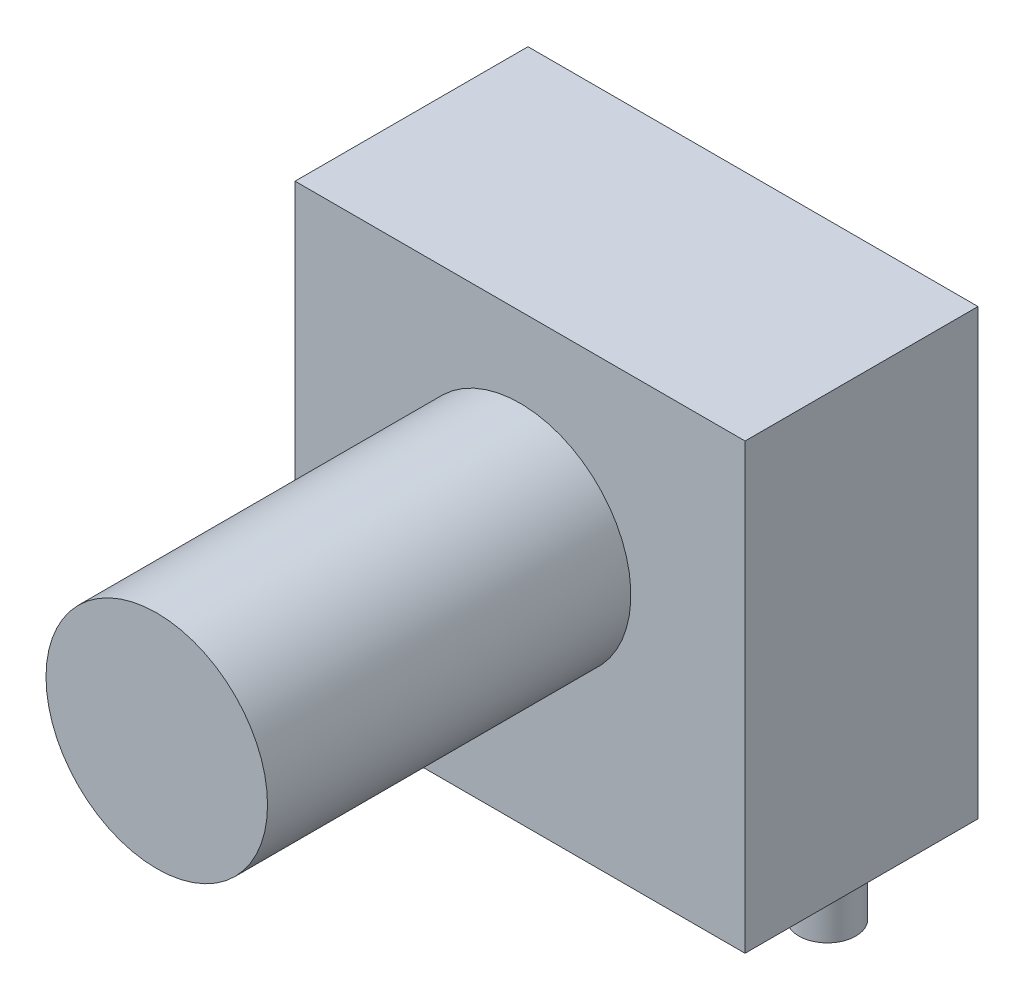
ISO-10303-21;
HEADER;
FILE_DESCRIPTION(('STEP AP214'),'2;1');
FILE_NAME('part.step','',(''),(''),'','','');
FILE_SCHEMA(('AUTOMOTIVE_DESIGN { 1 0 10303 214 1 1 1 1 }'));
ENDSEC;
DATA;
#1=APPLICATION_CONTEXT('core data for automotive mechanical design processes');
#2=APPLICATION_PROTOCOL_DEFINITION('international standard','automotive_design',2000,#1);
#3=PRODUCT_CONTEXT('',#1,'mechanical');
#4=PRODUCT('Part','Part','',(#3));
#5=PRODUCT_RELATED_PRODUCT_CATEGORY('part','',(#4));
#6=PRODUCT_DEFINITION_FORMATION('','',#4);
#7=PRODUCT_DEFINITION_CONTEXT('part definition',#1,'design');
#8=PRODUCT_DEFINITION('design','',#6,#7);
#9=PRODUCT_DEFINITION_SHAPE('','',#8);
#10=(LENGTH_UNIT() NAMED_UNIT(*) SI_UNIT(.MILLI.,.METRE.));
#11=(NAMED_UNIT(*) PLANE_ANGLE_UNIT() SI_UNIT($,.RADIAN.));
#12=(NAMED_UNIT(*) SI_UNIT($,.STERADIAN.) SOLID_ANGLE_UNIT());
#13=UNCERTAINTY_MEASURE_WITH_UNIT(LENGTH_MEASURE(1.E-05),#10,'distance_accuracy_value','');
#14=(GEOMETRIC_REPRESENTATION_CONTEXT(3) GLOBAL_UNCERTAINTY_ASSIGNED_CONTEXT((#13)) GLOBAL_UNIT_ASSIGNED_CONTEXT((#10,
#11,#12)) REPRESENTATION_CONTEXT('',''));
#15=CARTESIAN_POINT('',(0.,0.,0.));
#16=DIRECTION('',(0.,0.,1.));
#17=DIRECTION('',(1.,0.,0.));
#18=AXIS2_PLACEMENT_3D('',#15,#16,#17);
#19=CARTESIAN_POINT('',(-3.555,7.01,1.84));
#20=DIRECTION('',(0.,0.,-1.));
#21=DIRECTION('',(-1.,0.,0.));
#22=AXIS2_PLACEMENT_3D('',#19,#20,#21);
#23=PLANE('',#22);
#24=DIRECTION('',(1.,0.,0.));
#25=VECTOR('',#24,1.);
#26=CARTESIAN_POINT('',(-3.555,0.,1.84));
#27=LINE('',#26,#25);
#28=CARTESIAN_POINT('',(-3.555,0.,1.84));
#29=VERTEX_POINT('',#28);
#30=CARTESIAN_POINT('',(3.555,0.,1.84));
#31=VERTEX_POINT('',#30);
#32=EDGE_CURVE('E73',#29,#31,#27,.T.);
#33=ORIENTED_EDGE('',*,*,#32,.T.);
#34=DIRECTION('',(0.,-1.,0.));
#35=VECTOR('',#34,1.);
#36=CARTESIAN_POINT('',(3.555,7.01,1.84));
#37=LINE('',#36,#35);
#38=CARTESIAN_POINT('',(3.555,7.01,1.84));
#39=VERTEX_POINT('',#38);
#40=EDGE_CURVE('E97',#39,#31,#37,.T.);
#41=ORIENTED_EDGE('',*,*,#40,.F.);
#42=DIRECTION('',(1.,0.,0.));
#43=VECTOR('',#42,1.);
#44=CARTESIAN_POINT('',(-3.555,7.01,1.84));
#45=LINE('',#44,#43);
#46=CARTESIAN_POINT('',(-3.555,7.01,1.84));
#47=VERTEX_POINT('',#46);
#48=EDGE_CURVE('E50',#47,#39,#45,.T.);
#49=ORIENTED_EDGE('',*,*,#48,.F.);
#50=DIRECTION('',(0.,-1.,0.));
#51=VECTOR('',#50,1.);
#52=CARTESIAN_POINT('',(-3.555,7.01,1.84));
#53=LINE('',#52,#51);
#54=EDGE_CURVE('E93',#47,#29,#53,.T.);
#55=ORIENTED_EDGE('',*,*,#54,.T.);
#56=EDGE_LOOP('',(#33,#41,#49,#55));
#57=FACE_BOUND('',#56,.T.);
#58=CARTESIAN_POINT('',(0.,4.,1.84));
#59=DIRECTION('',(0.,0.,-1.));
#60=DIRECTION('',(-1.,0.,0.));
#61=AXIS2_PLACEMENT_3D('',#58,#59,#60);
#62=CIRCLE('',#61,1.75);
#63=CARTESIAN_POINT('',(-1.75,4.,1.84));
#64=VERTEX_POINT('',#63);
#65=EDGE_CURVE('E111',#64,#64,#62,.F.);
#66=ORIENTED_EDGE('',*,*,#65,.F.);
#67=EDGE_LOOP('',(#66));
#68=FACE_BOUND('',#67,.T.);
#69=ADVANCED_FACE('F33',(#57,#68),#23,.F.);
#70=CARTESIAN_POINT('',(3.555,7.01,1.84));
#71=DIRECTION('',(-1.,0.,0.));
#72=DIRECTION('',(0.,0.,1.));
#73=AXIS2_PLACEMENT_3D('',#70,#71,#72);
#74=PLANE('',#73);
#75=DIRECTION('',(0.,0.,-1.));
#76=VECTOR('',#75,1.);
#77=CARTESIAN_POINT('',(3.555,0.,1.84));
#78=LINE('',#77,#76);
#79=CARTESIAN_POINT('',(3.555,0.,-1.84));
#80=VERTEX_POINT('',#79);
#81=EDGE_CURVE('E101',#31,#80,#78,.T.);
#82=ORIENTED_EDGE('',*,*,#81,.T.);
#83=DIRECTION('',(0.,-1.,0.));
#84=VECTOR('',#83,1.);
#85=CARTESIAN_POINT('',(3.555,7.01,-1.84));
#86=LINE('',#85,#84);
#87=CARTESIAN_POINT('',(3.555,7.01,-1.84));
#88=VERTEX_POINT('',#87);
#89=EDGE_CURVE('E92',#88,#80,#86,.T.);
#90=ORIENTED_EDGE('',*,*,#89,.F.);
#91=DIRECTION('',(0.,0.,-1.));
#92=VECTOR('',#91,1.);
#93=CARTESIAN_POINT('',(3.555,7.01,1.84));
#94=LINE('',#93,#92);
#95=EDGE_CURVE('E86',#39,#88,#94,.T.);
#96=ORIENTED_EDGE('',*,*,#95,.F.);
#97=ORIENTED_EDGE('',*,*,#40,.T.);
#98=EDGE_LOOP('',(#82,#90,#96,#97));
#99=FACE_BOUND('',#98,.T.);
#100=ADVANCED_FACE('F35',(#99),#74,.F.);
#101=CARTESIAN_POINT('',(-3.555,7.01,-1.84));
#102=DIRECTION('',(0.,0.,1.));
#103=DIRECTION('',(1.,0.,0.));
#104=AXIS2_PLACEMENT_3D('',#101,#102,#103);
#105=PLANE('',#104);
#106=DIRECTION('',(-1.,0.,0.));
#107=VECTOR('',#106,1.);
#108=CARTESIAN_POINT('',(-3.555,0.,-1.84));
#109=LINE('',#108,#107);
#110=CARTESIAN_POINT('',(-3.555,0.,-1.84));
#111=VERTEX_POINT('',#110);
#112=EDGE_CURVE('E91',#80,#111,#109,.T.);
#113=ORIENTED_EDGE('',*,*,#112,.T.);
#114=DIRECTION('',(0.,-1.,0.));
#115=VECTOR('',#114,1.);
#116=CARTESIAN_POINT('',(-3.555,7.01,-1.84));
#117=LINE('',#116,#115);
#118=CARTESIAN_POINT('',(-3.555,7.01,-1.84));
#119=VERTEX_POINT('',#118);
#120=EDGE_CURVE('E89',#119,#111,#117,.T.);
#121=ORIENTED_EDGE('',*,*,#120,.F.);
#122=DIRECTION('',(-1.,0.,0.));
#123=VECTOR('',#122,1.);
#124=CARTESIAN_POINT('',(-3.555,7.01,-1.84));
#125=LINE('',#124,#123);
#126=EDGE_CURVE('E81',#88,#119,#125,.T.);
#127=ORIENTED_EDGE('',*,*,#126,.F.);
#128=ORIENTED_EDGE('',*,*,#89,.T.);
#129=EDGE_LOOP('',(#113,#121,#127,#128));
#130=FACE_BOUND('',#129,.T.);
#131=ADVANCED_FACE('F90',(#130),#105,.F.);
#132=CARTESIAN_POINT('',(-3.555,7.01,1.84));
#133=DIRECTION('',(1.,0.,0.));
#134=DIRECTION('',(0.,0.,-1.));
#135=AXIS2_PLACEMENT_3D('',#132,#133,#134);
#136=PLANE('',#135);
#137=DIRECTION('',(0.,0.,1.));
#138=VECTOR('',#137,1.);
#139=CARTESIAN_POINT('',(-3.555,0.,1.84));
#140=LINE('',#139,#138);
#141=EDGE_CURVE('E67',#111,#29,#140,.T.);
#142=ORIENTED_EDGE('',*,*,#141,.T.);
#143=ORIENTED_EDGE('',*,*,#54,.F.);
#144=DIRECTION('',(0.,0.,1.));
#145=VECTOR('',#144,1.);
#146=CARTESIAN_POINT('',(-3.555,7.01,1.84));
#147=LINE('',#146,#145);
#148=EDGE_CURVE('E84',#119,#47,#147,.T.);
#149=ORIENTED_EDGE('',*,*,#148,.F.);
#150=ORIENTED_EDGE('',*,*,#120,.T.);
#151=EDGE_LOOP('',(#142,#143,#149,#150));
#152=FACE_BOUND('',#151,.T.);
#153=ADVANCED_FACE('F95',(#152),#136,.F.);
#154=CARTESIAN_POINT('',(0.,7.01,0.));
#155=DIRECTION('',(0.,-1.,0.));
#156=DIRECTION('',(0.,0.,-1.));
#157=AXIS2_PLACEMENT_3D('',#154,#155,#156);
#158=PLANE('',#157);
#159=ORIENTED_EDGE('',*,*,#95,.T.);
#160=ORIENTED_EDGE('',*,*,#126,.T.);
#161=ORIENTED_EDGE('',*,*,#148,.T.);
#162=ORIENTED_EDGE('',*,*,#48,.T.);
#163=EDGE_LOOP('',(#159,#160,#161,#162));
#164=FACE_BOUND('',#163,.T.);
#165=ADVANCED_FACE('F82',(#164),#158,.F.);
#166=CARTESIAN_POINT('',(0.,0.,0.));
#167=DIRECTION('',(0.,-1.,0.));
#168=DIRECTION('',(0.,0.,-1.));
#169=AXIS2_PLACEMENT_3D('',#166,#167,#168);
#170=PLANE('',#169);
#171=CARTESIAN_POINT('',(2.245,0.,-0.769999999999998));
#172=DIRECTION('',(0.,-1.,0.));
#173=DIRECTION('',(0.,0.,-1.));
#174=AXIS2_PLACEMENT_3D('',#171,#172,#173);
#175=CIRCLE('',#174,0.45);
#176=CARTESIAN_POINT('',(2.245,0.,-1.22));
#177=VERTEX_POINT('',#176);
#178=EDGE_CURVE('E11',#177,#177,#175,.T.);
#179=ORIENTED_EDGE('',*,*,#178,.F.);
#180=EDGE_LOOP('',(#179));
#181=FACE_BOUND('',#180,.T.);
#182=CARTESIAN_POINT('',(-2.245,0.,-0.769999999999998));
#183=DIRECTION('',(0.,-1.,0.));
#184=DIRECTION('',(0.,0.,-1.));
#185=AXIS2_PLACEMENT_3D('',#182,#183,#184);
#186=CIRCLE('',#185,0.45);
#187=CARTESIAN_POINT('',(-2.245,0.,-1.22));
#188=VERTEX_POINT('',#187);
#189=EDGE_CURVE('E42',#188,#188,#186,.T.);
#190=ORIENTED_EDGE('',*,*,#189,.F.);
#191=EDGE_LOOP('',(#190));
#192=FACE_BOUND('',#191,.T.);
#193=ORIENTED_EDGE('',*,*,#81,.F.);
#194=ORIENTED_EDGE('',*,*,#32,.F.);
#195=ORIENTED_EDGE('',*,*,#141,.F.);
#196=ORIENTED_EDGE('',*,*,#112,.F.);
#197=EDGE_LOOP('',(#193,#194,#195,#196));
#198=FACE_BOUND('',#197,.T.);
#199=ADVANCED_FACE('F118',(#181,#192,#198),#170,.T.);
#200=CARTESIAN_POINT('',(0.,4.,7.58));
#201=DIRECTION('',(0.,0.,-1.));
#202=DIRECTION('',(-1.,0.,0.));
#203=AXIS2_PLACEMENT_3D('',#200,#201,#202);
#204=CYLINDRICAL_SURFACE('',#203,1.75);
#205=CARTESIAN_POINT('',(0.,4.,7.58));
#206=DIRECTION('',(0.,0.,1.));
#207=DIRECTION('',(1.,0.,0.));
#208=AXIS2_PLACEMENT_3D('',#205,#206,#207);
#209=CIRCLE('',#208,1.75);
#210=CARTESIAN_POINT('',(1.75,4.,7.58));
#211=VERTEX_POINT('',#210);
#212=EDGE_CURVE('E104',#211,#211,#209,.T.);
#213=ORIENTED_EDGE('',*,*,#212,.F.);
#214=EDGE_LOOP('',(#213));
#215=FACE_BOUND('',#214,.T.);
#216=ORIENTED_EDGE('',*,*,#65,.T.);
#217=EDGE_LOOP('',(#216));
#218=FACE_BOUND('',#217,.T.);
#219=ADVANCED_FACE('F121',(#215,#218),#204,.T.);
#220=CARTESIAN_POINT('',(0.,4.,7.58));
#221=DIRECTION('',(0.,0.,1.));
#222=DIRECTION('',(1.,0.,0.));
#223=AXIS2_PLACEMENT_3D('',#220,#221,#222);
#224=PLANE('',#223);
#225=ORIENTED_EDGE('',*,*,#212,.T.);
#226=EDGE_LOOP('',(#225));
#227=FACE_BOUND('',#226,.T.);
#228=ADVANCED_FACE('F132',(#227),#224,.T.);
#229=CARTESIAN_POINT('',(-2.245,-1.5,-0.769999999999998));
#230=DIRECTION('',(0.,1.,0.));
#231=DIRECTION('',(0.,0.,1.));
#232=AXIS2_PLACEMENT_3D('',#229,#230,#231);
#233=CYLINDRICAL_SURFACE('',#232,0.45);
#234=CARTESIAN_POINT('',(-2.245,-1.5,-0.769999999999998));
#235=DIRECTION('',(0.,1.,0.));
#236=DIRECTION('',(0.,0.,1.));
#237=AXIS2_PLACEMENT_3D('',#234,#235,#236);
#238=CIRCLE('',#237,0.45);
#239=CARTESIAN_POINT('',(-2.245,-1.5,-0.319999999999998));
#240=VERTEX_POINT('',#239);
#241=EDGE_CURVE('E221',#240,#240,#238,.T.);
#242=ORIENTED_EDGE('',*,*,#241,.T.);
#243=EDGE_LOOP('',(#242));
#244=FACE_BOUND('',#243,.T.);
#245=ORIENTED_EDGE('',*,*,#189,.T.);
#246=EDGE_LOOP('',(#245));
#247=FACE_BOUND('',#246,.T.);
#248=ADVANCED_FACE('F116',(#244,#247),#233,.T.);
#249=CARTESIAN_POINT('',(-2.245,-1.5,-0.769999999999998));
#250=DIRECTION('',(0.,1.,0.));
#251=DIRECTION('',(0.,0.,1.));
#252=AXIS2_PLACEMENT_3D('',#249,#250,#251);
#253=PLANE('',#252);
#254=ORIENTED_EDGE('',*,*,#241,.F.);
#255=EDGE_LOOP('',(#254));
#256=FACE_BOUND('',#255,.T.);
#257=ADVANCED_FACE('F185',(#256),#253,.F.);
#258=CARTESIAN_POINT('',(2.245,-1.5,-0.769999999999998));
#259=DIRECTION('',(0.,1.,0.));
#260=DIRECTION('',(0.,0.,1.));
#261=AXIS2_PLACEMENT_3D('',#258,#259,#260);
#262=CYLINDRICAL_SURFACE('',#261,0.45);
#263=CARTESIAN_POINT('',(2.245,-1.5,-0.769999999999998));
#264=DIRECTION('',(0.,1.,0.));
#265=DIRECTION('',(0.,0.,1.));
#266=AXIS2_PLACEMENT_3D('',#263,#264,#265);
#267=CIRCLE('',#266,0.45);
#268=CARTESIAN_POINT('',(2.245,-1.5,-0.319999999999998));
#269=VERTEX_POINT('',#268);
#270=EDGE_CURVE('E220',#269,#269,#267,.T.);
#271=ORIENTED_EDGE('',*,*,#270,.T.);
#272=EDGE_LOOP('',(#271));
#273=FACE_BOUND('',#272,.T.);
#274=ORIENTED_EDGE('',*,*,#178,.T.);
#275=EDGE_LOOP('',(#274));
#276=FACE_BOUND('',#275,.T.);
#277=ADVANCED_FACE('F194',(#273,#276),#262,.T.);
#278=CARTESIAN_POINT('',(2.245,-1.5,-0.769999999999998));
#279=DIRECTION('',(0.,1.,0.));
#280=DIRECTION('',(0.,0.,1.));
#281=AXIS2_PLACEMENT_3D('',#278,#279,#280);
#282=PLANE('',#281);
#283=ORIENTED_EDGE('',*,*,#270,.F.);
#284=EDGE_LOOP('',(#283));
#285=FACE_BOUND('',#284,.T.);
#286=ADVANCED_FACE('F204',(#285),#282,.F.);
#287=CLOSED_SHELL('',(#69,#100,#131,#153,#165,#199,#219,#228,#248,#257,#277,#286));
#288=MANIFOLD_SOLID_BREP('B2',#287);
#289=ADVANCED_BREP_SHAPE_REPRESENTATION('',(#18,#288),#14);
#290=SHAPE_DEFINITION_REPRESENTATION(#9,#289);
ENDSEC;
END-ISO-10303-21;
